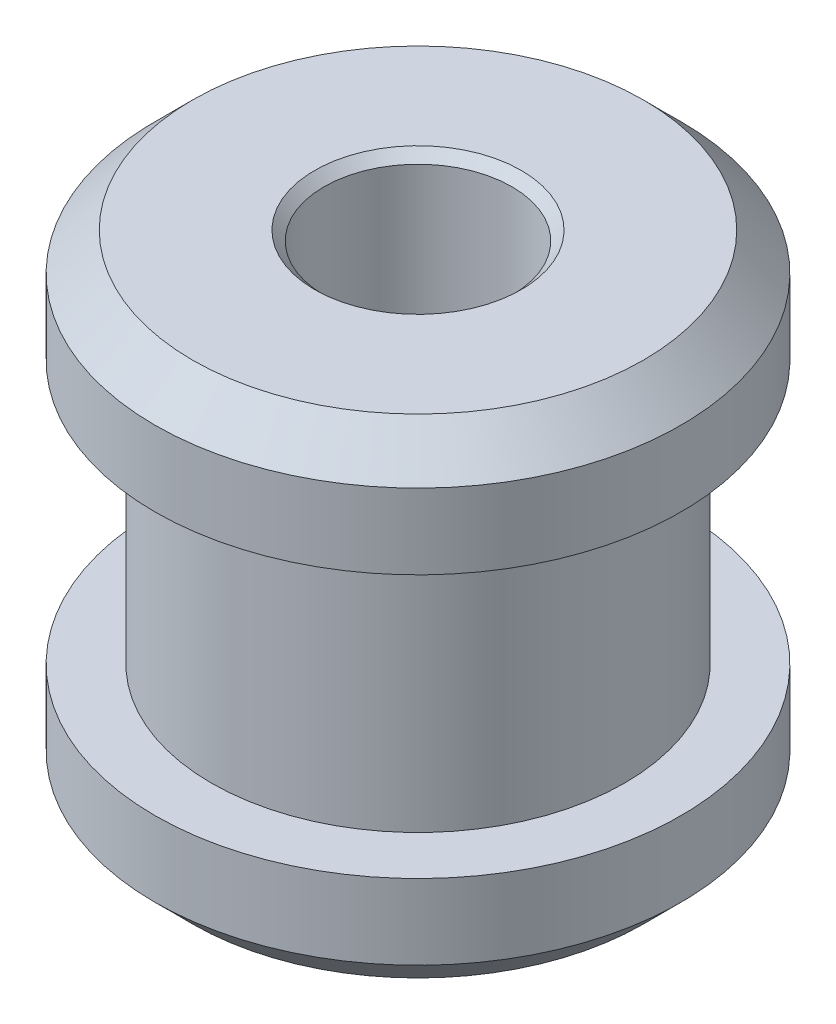
ISO-10303-21;
HEADER;
FILE_DESCRIPTION(('STEP AP214'),'2;1');
FILE_NAME('part.step','',(''),(''),'','','');
FILE_SCHEMA(('AUTOMOTIVE_DESIGN { 1 0 10303 214 1 1 1 1 }'));
ENDSEC;
DATA;
#1=APPLICATION_CONTEXT('core data for automotive mechanical design processes');
#2=APPLICATION_PROTOCOL_DEFINITION('international standard','automotive_design',2000,#1);
#3=PRODUCT_CONTEXT('',#1,'mechanical');
#4=PRODUCT('Part','Part','',(#3));
#5=PRODUCT_RELATED_PRODUCT_CATEGORY('part','',(#4));
#6=PRODUCT_DEFINITION_FORMATION('','',#4);
#7=PRODUCT_DEFINITION_CONTEXT('part definition',#1,'design');
#8=PRODUCT_DEFINITION('design','',#6,#7);
#9=PRODUCT_DEFINITION_SHAPE('','',#8);
#10=(LENGTH_UNIT() NAMED_UNIT(*) SI_UNIT(.MILLI.,.METRE.));
#11=(NAMED_UNIT(*) PLANE_ANGLE_UNIT() SI_UNIT($,.RADIAN.));
#12=(NAMED_UNIT(*) SI_UNIT($,.STERADIAN.) SOLID_ANGLE_UNIT());
#13=UNCERTAINTY_MEASURE_WITH_UNIT(LENGTH_MEASURE(1.E-05),#10,'distance_accuracy_value','');
#14=(GEOMETRIC_REPRESENTATION_CONTEXT(3) GLOBAL_UNCERTAINTY_ASSIGNED_CONTEXT((#13)) GLOBAL_UNIT_ASSIGNED_CONTEXT((#10,
#11,#12)) REPRESENTATION_CONTEXT('',''));
#15=CARTESIAN_POINT('',(0.,0.,0.));
#16=DIRECTION('',(0.,0.,1.));
#17=DIRECTION('',(1.,0.,0.));
#18=AXIS2_PLACEMENT_3D('',#15,#16,#17);
#19=CARTESIAN_POINT('',(0.,-3.5,0.));
#20=DIRECTION('',(0.,1.,0.));
#21=DIRECTION('',(0.,0.,1.));
#22=AXIS2_PLACEMENT_3D('',#19,#20,#21);
#23=CYLINDRICAL_SURFACE('',#22,5.500000001);
#24=CARTESIAN_POINT('',(0.,-3.5,0.));
#25=DIRECTION('',(0.,-1.,0.));
#26=DIRECTION('',(0.,0.,-1.));
#27=AXIS2_PLACEMENT_3D('',#24,#25,#26);
#28=CIRCLE('',#27,5.500000001);
#29=CARTESIAN_POINT('',(0.,-3.5,-5.500000001));
#30=VERTEX_POINT('',#29);
#31=EDGE_CURVE('E67',#30,#30,#28,.T.);
#32=ORIENTED_EDGE('',*,*,#31,.F.);
#33=EDGE_LOOP('',(#32));
#34=FACE_BOUND('',#33,.T.);
#35=CARTESIAN_POINT('',(0.,3.5,0.));
#36=DIRECTION('',(0.,1.,0.));
#37=DIRECTION('',(0.,0.,1.));
#38=AXIS2_PLACEMENT_3D('',#35,#36,#37);
#39=CIRCLE('',#38,5.500000001);
#40=CARTESIAN_POINT('',(0.,3.5,5.500000001));
#41=VERTEX_POINT('',#40);
#42=EDGE_CURVE('E74',#41,#41,#39,.T.);
#43=ORIENTED_EDGE('',*,*,#42,.F.);
#44=EDGE_LOOP('',(#43));
#45=FACE_BOUND('',#44,.T.);
#46=ADVANCED_FACE('F34',(#34,#45),#23,.T.);
#47=CARTESIAN_POINT('',(0.,-6.5,0.));
#48=DIRECTION('',(0.,1.,0.));
#49=DIRECTION('',(0.,0.,1.));
#50=AXIS2_PLACEMENT_3D('',#47,#48,#49);
#51=CYLINDRICAL_SURFACE('',#50,7.000000001);
#52=CARTESIAN_POINT('',(0.,-5.49999999999963,0.));
#53=DIRECTION('',(0.,-1.,0.));
#54=DIRECTION('',(0.,0.,-1.));
#55=AXIS2_PLACEMENT_3D('',#52,#53,#54);
#56=CIRCLE('',#55,7.000000001);
#57=CARTESIAN_POINT('',(0.,-5.49999999999963,-7.000000001));
#58=VERTEX_POINT('',#57);
#59=EDGE_CURVE('E64',#58,#58,#56,.F.);
#60=ORIENTED_EDGE('',*,*,#59,.T.);
#61=EDGE_LOOP('',(#60));
#62=FACE_BOUND('',#61,.T.);
#63=CARTESIAN_POINT('',(0.,-3.5,0.));
#64=DIRECTION('',(0.,1.,0.));
#65=DIRECTION('',(0.,0.,-1.));
#66=AXIS2_PLACEMENT_3D('',#63,#64,#65);
#67=CIRCLE('',#66,7.000000001);
#68=CARTESIAN_POINT('',(0.,-3.5,-7.000000001));
#69=VERTEX_POINT('',#68);
#70=EDGE_CURVE('E71',#69,#69,#67,.T.);
#71=ORIENTED_EDGE('',*,*,#70,.F.);
#72=EDGE_LOOP('',(#71));
#73=FACE_BOUND('',#72,.T.);
#74=ADVANCED_FACE('F100',(#62,#73),#51,.T.);
#75=CARTESIAN_POINT('',(0.,-6.5,0.));
#76=DIRECTION('',(0.,-1.,0.));
#77=DIRECTION('',(0.,0.,-1.));
#78=AXIS2_PLACEMENT_3D('',#75,#76,#77);
#79=PLANE('',#78);
#80=CARTESIAN_POINT('',(0.,-6.5,0.));
#81=DIRECTION('',(0.,-1.,0.));
#82=DIRECTION('',(0.,0.,-1.));
#83=AXIS2_PLACEMENT_3D('',#80,#81,#82);
#84=CIRCLE('',#83,2.74999999999997);
#85=CARTESIAN_POINT('',(0.,-6.5,-2.74999999999997));
#86=VERTEX_POINT('',#85);
#87=EDGE_CURVE('E49',#86,#86,#84,.F.);
#88=ORIENTED_EDGE('',*,*,#87,.T.);
#89=EDGE_LOOP('',(#88));
#90=FACE_BOUND('',#89,.T.);
#91=CARTESIAN_POINT('',(0.,-6.5,0.));
#92=DIRECTION('',(0.,-1.,0.));
#93=DIRECTION('',(0.,0.,-1.));
#94=AXIS2_PLACEMENT_3D('',#91,#92,#93);
#95=CIRCLE('',#94,6.00000000099963);
#96=CARTESIAN_POINT('',(0.,-6.5,-6.00000000099963));
#97=VERTEX_POINT('',#96);
#98=EDGE_CURVE('E60',#97,#97,#95,.T.);
#99=ORIENTED_EDGE('',*,*,#98,.T.);
#100=EDGE_LOOP('',(#99));
#101=FACE_BOUND('',#100,.T.);
#102=ADVANCED_FACE('F106',(#90,#101),#79,.T.);
#103=CARTESIAN_POINT('',(0.,-3.5,0.));
#104=DIRECTION('',(0.,-1.,0.));
#105=DIRECTION('',(0.,0.,-1.));
#106=AXIS2_PLACEMENT_3D('',#103,#104,#105);
#107=PLANE('',#106);
#108=ORIENTED_EDGE('',*,*,#31,.T.);
#109=EDGE_LOOP('',(#108));
#110=FACE_BOUND('',#109,.T.);
#111=ORIENTED_EDGE('',*,*,#70,.T.);
#112=EDGE_LOOP('',(#111));
#113=FACE_BOUND('',#112,.T.);
#114=ADVANCED_FACE('F115',(#110,#113),#107,.F.);
#115=CARTESIAN_POINT('',(0.,-5.49999999999963,0.));
#116=DIRECTION('',(0.,1.,0.));
#117=DIRECTION('',(0.,0.,1.));
#118=AXIS2_PLACEMENT_3D('',#115,#116,#117);
#119=CONICAL_SURFACE('',#118,7.000000001,0.785398163397452);
#120=ORIENTED_EDGE('',*,*,#98,.F.);
#121=EDGE_LOOP('',(#120));
#122=FACE_BOUND('',#121,.T.);
#123=ORIENTED_EDGE('',*,*,#59,.F.);
#124=EDGE_LOOP('',(#123));
#125=FACE_BOUND('',#124,.T.);
#126=ADVANCED_FACE('F113',(#122,#125),#119,.T.);
#127=CARTESIAN_POINT('',(0.,6.5,0.));
#128=DIRECTION('',(0.,-1.,0.));
#129=DIRECTION('',(0.,0.,-1.));
#130=AXIS2_PLACEMENT_3D('',#127,#128,#129);
#131=CYLINDRICAL_SURFACE('',#130,7.000000001);
#132=CARTESIAN_POINT('',(0.,5.49999999999962,0.));
#133=DIRECTION('',(0.,1.,0.));
#134=DIRECTION('',(0.,0.,1.));
#135=AXIS2_PLACEMENT_3D('',#132,#133,#134);
#136=CIRCLE('',#135,7.000000001);
#137=CARTESIAN_POINT('',(0.,5.49999999999962,7.000000001));
#138=VERTEX_POINT('',#137);
#139=EDGE_CURVE('E54',#138,#138,#136,.F.);
#140=ORIENTED_EDGE('',*,*,#139,.T.);
#141=EDGE_LOOP('',(#140));
#142=FACE_BOUND('',#141,.T.);
#143=CARTESIAN_POINT('',(0.,3.5,0.));
#144=DIRECTION('',(0.,1.,0.));
#145=DIRECTION('',(0.,0.,-1.));
#146=AXIS2_PLACEMENT_3D('',#143,#144,#145);
#147=CIRCLE('',#146,7.000000001);
#148=CARTESIAN_POINT('',(0.,3.5,-7.000000001));
#149=VERTEX_POINT('',#148);
#150=EDGE_CURVE('E78',#149,#149,#147,.T.);
#151=ORIENTED_EDGE('',*,*,#150,.T.);
#152=EDGE_LOOP('',(#151));
#153=FACE_BOUND('',#152,.T.);
#154=ADVANCED_FACE('F82',(#142,#153),#131,.T.);
#155=CARTESIAN_POINT('',(0.,6.5,0.));
#156=DIRECTION('',(0.,1.,0.));
#157=DIRECTION('',(0.,0.,-1.));
#158=AXIS2_PLACEMENT_3D('',#155,#156,#157);
#159=PLANE('',#158);
#160=CARTESIAN_POINT('',(0.,6.5,0.));
#161=DIRECTION('',(0.,1.,0.));
#162=DIRECTION('',(0.,0.,1.));
#163=AXIS2_PLACEMENT_3D('',#160,#161,#162);
#164=CIRCLE('',#163,2.74999999999997);
#165=CARTESIAN_POINT('',(0.,6.5,2.74999999999997));
#166=VERTEX_POINT('',#165);
#167=EDGE_CURVE('E10',#166,#166,#164,.F.);
#168=ORIENTED_EDGE('',*,*,#167,.T.);
#169=EDGE_LOOP('',(#168));
#170=FACE_BOUND('',#169,.T.);
#171=CARTESIAN_POINT('',(0.,6.5,0.));
#172=DIRECTION('',(0.,1.,0.));
#173=DIRECTION('',(0.,0.,1.));
#174=AXIS2_PLACEMENT_3D('',#171,#172,#173);
#175=CIRCLE('',#174,6.00000000099962);
#176=CARTESIAN_POINT('',(0.,6.5,6.00000000099962));
#177=VERTEX_POINT('',#176);
#178=EDGE_CURVE('E57',#177,#177,#175,.T.);
#179=ORIENTED_EDGE('',*,*,#178,.T.);
#180=EDGE_LOOP('',(#179));
#181=FACE_BOUND('',#180,.T.);
#182=ADVANCED_FACE('F87',(#170,#181),#159,.T.);
#183=CARTESIAN_POINT('',(0.,3.5,0.));
#184=DIRECTION('',(0.,1.,0.));
#185=DIRECTION('',(0.,0.,-1.));
#186=AXIS2_PLACEMENT_3D('',#183,#184,#185);
#187=PLANE('',#186);
#188=ORIENTED_EDGE('',*,*,#42,.T.);
#189=EDGE_LOOP('',(#188));
#190=FACE_BOUND('',#189,.T.);
#191=ORIENTED_EDGE('',*,*,#150,.F.);
#192=EDGE_LOOP('',(#191));
#193=FACE_BOUND('',#192,.T.);
#194=ADVANCED_FACE('F84',(#190,#193),#187,.F.);
#195=CARTESIAN_POINT('',(0.,6.5,0.));
#196=DIRECTION('',(0.,-1.,0.));
#197=DIRECTION('',(0.,0.,-1.));
#198=AXIS2_PLACEMENT_3D('',#195,#196,#197);
#199=CONICAL_SURFACE('',#198,6.00000000099962,0.785398163397452);
#200=ORIENTED_EDGE('',*,*,#139,.F.);
#201=EDGE_LOOP('',(#200));
#202=FACE_BOUND('',#201,.T.);
#203=ORIENTED_EDGE('',*,*,#178,.F.);
#204=EDGE_LOOP('',(#203));
#205=FACE_BOUND('',#204,.T.);
#206=ADVANCED_FACE('F86',(#202,#205),#199,.T.);
#207=CARTESIAN_POINT('',(0.,-6.5,0.));
#208=DIRECTION('',(0.,1.,0.));
#209=DIRECTION('',(0.,0.,1.));
#210=AXIS2_PLACEMENT_3D('',#207,#208,#209);
#211=CYLINDRICAL_SURFACE('',#210,2.5);
#212=CARTESIAN_POINT('',(0.,-6.25000000000002,0.));
#213=DIRECTION('',(0.,-1.,0.));
#214=DIRECTION('',(0.,0.,-1.));
#215=AXIS2_PLACEMENT_3D('',#212,#213,#214);
#216=CIRCLE('',#215,2.5);
#217=CARTESIAN_POINT('',(0.,-6.25000000000002,-2.5));
#218=VERTEX_POINT('',#217);
#219=EDGE_CURVE('E41',#218,#218,#216,.T.);
#220=ORIENTED_EDGE('',*,*,#219,.T.);
#221=EDGE_LOOP('',(#220));
#222=FACE_BOUND('',#221,.T.);
#223=CARTESIAN_POINT('',(0.,6.25000000000002,0.));
#224=DIRECTION('',(0.,1.,0.));
#225=DIRECTION('',(0.,0.,1.));
#226=AXIS2_PLACEMENT_3D('',#223,#224,#225);
#227=CIRCLE('',#226,2.5);
#228=CARTESIAN_POINT('',(0.,6.25000000000002,2.5));
#229=VERTEX_POINT('',#228);
#230=EDGE_CURVE('E45',#229,#229,#227,.T.);
#231=ORIENTED_EDGE('',*,*,#230,.T.);
#232=EDGE_LOOP('',(#231));
#233=FACE_BOUND('',#232,.T.);
#234=ADVANCED_FACE('F94',(#222,#233),#211,.F.);
#235=CARTESIAN_POINT('',(0.,-6.5,0.));
#236=DIRECTION('',(0.,-1.,0.));
#237=DIRECTION('',(0.,0.,-1.));
#238=AXIS2_PLACEMENT_3D('',#235,#236,#237);
#239=CONICAL_SURFACE('',#238,2.74999999999997,0.785398163397446);
#240=ORIENTED_EDGE('',*,*,#219,.F.);
#241=EDGE_LOOP('',(#240));
#242=FACE_BOUND('',#241,.T.);
#243=ORIENTED_EDGE('',*,*,#87,.F.);
#244=EDGE_LOOP('',(#243));
#245=FACE_BOUND('',#244,.T.);
#246=ADVANCED_FACE('F117',(#242,#245),#239,.F.);
#247=CARTESIAN_POINT('',(0.,6.25000000000002,0.));
#248=DIRECTION('',(0.,1.,0.));
#249=DIRECTION('',(0.,0.,1.));
#250=AXIS2_PLACEMENT_3D('',#247,#248,#249);
#251=CONICAL_SURFACE('',#250,2.5,0.785398163397446);
#252=ORIENTED_EDGE('',*,*,#167,.F.);
#253=EDGE_LOOP('',(#252));
#254=FACE_BOUND('',#253,.T.);
#255=ORIENTED_EDGE('',*,*,#230,.F.);
#256=EDGE_LOOP('',(#255));
#257=FACE_BOUND('',#256,.T.);
#258=ADVANCED_FACE('F36',(#254,#257),#251,.F.);
#259=CLOSED_SHELL('',(#46,#74,#102,#114,#126,#154,#182,#194,#206,#234,#246,#258));
#260=MANIFOLD_SOLID_BREP('B2',#259);
#261=ADVANCED_BREP_SHAPE_REPRESENTATION('',(#18,#260),#14);
#262=SHAPE_DEFINITION_REPRESENTATION(#9,#261);
ENDSEC;
END-ISO-10303-21;
